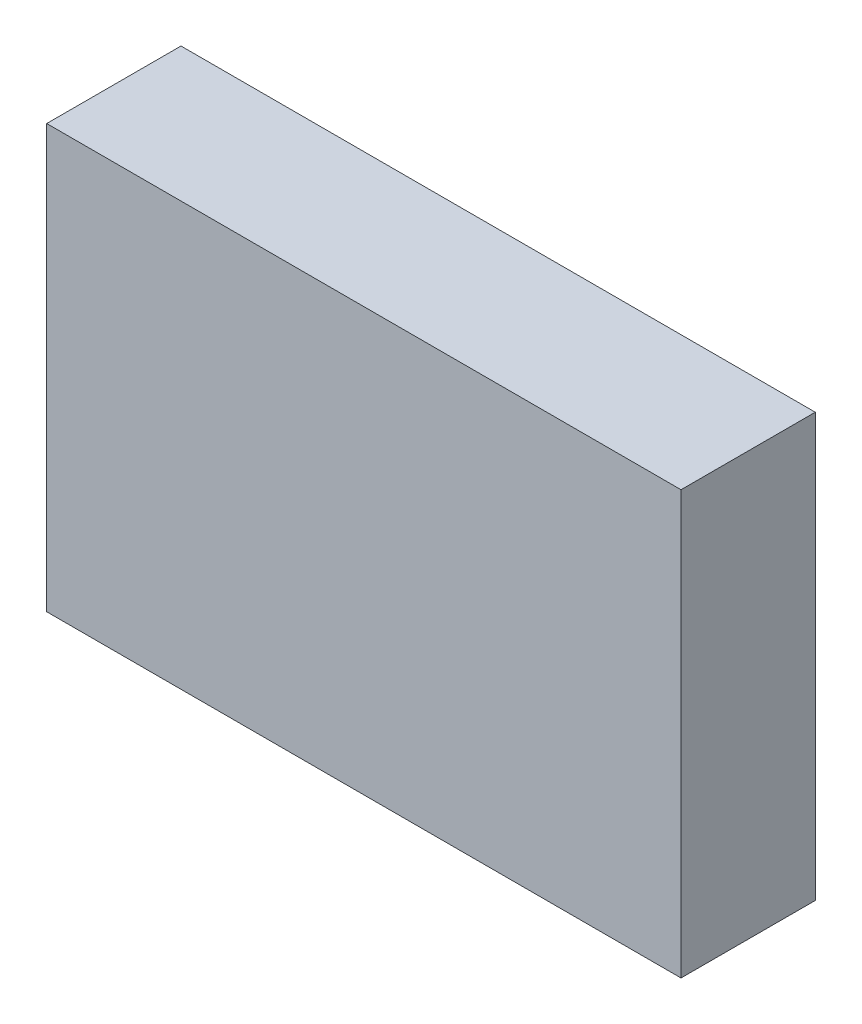
ISO-10303-21;
HEADER;
FILE_DESCRIPTION(('STEP AP214'),'2;1');
FILE_NAME('part.step','',(''),(''),'','','');
FILE_SCHEMA(('AUTOMOTIVE_DESIGN { 1 0 10303 214 1 1 1 1 }'));
ENDSEC;
DATA;
#1=APPLICATION_CONTEXT('core data for automotive mechanical design processes');
#2=APPLICATION_PROTOCOL_DEFINITION('international standard','automotive_design',2000,#1);
#3=PRODUCT_CONTEXT('',#1,'mechanical');
#4=PRODUCT('Part','Part','',(#3));
#5=PRODUCT_RELATED_PRODUCT_CATEGORY('part','',(#4));
#6=PRODUCT_DEFINITION_FORMATION('','',#4);
#7=PRODUCT_DEFINITION_CONTEXT('part definition',#1,'design');
#8=PRODUCT_DEFINITION('design','',#6,#7);
#9=PRODUCT_DEFINITION_SHAPE('','',#8);
#10=(LENGTH_UNIT() NAMED_UNIT(*) SI_UNIT(.MILLI.,.METRE.));
#11=(NAMED_UNIT(*) PLANE_ANGLE_UNIT() SI_UNIT($,.RADIAN.));
#12=(NAMED_UNIT(*) SI_UNIT($,.STERADIAN.) SOLID_ANGLE_UNIT());
#13=UNCERTAINTY_MEASURE_WITH_UNIT(LENGTH_MEASURE(1.E-05),#10,'distance_accuracy_value','');
#14=(GEOMETRIC_REPRESENTATION_CONTEXT(3) GLOBAL_UNCERTAINTY_ASSIGNED_CONTEXT((#13)) GLOBAL_UNIT_ASSIGNED_CONTEXT((#10,
#11,#12)) REPRESENTATION_CONTEXT('',''));
#15=CARTESIAN_POINT('',(0.,0.,0.));
#16=DIRECTION('',(0.,0.,1.));
#17=DIRECTION('',(1.,0.,0.));
#18=AXIS2_PLACEMENT_3D('',#15,#16,#17);
#19=CARTESIAN_POINT('',(-60.,-40.,25.4));
#20=DIRECTION('',(1.,0.,0.));
#21=DIRECTION('',(0.,0.,-1.));
#22=AXIS2_PLACEMENT_3D('',#19,#20,#21);
#23=PLANE('',#22);
#24=DIRECTION('',(0.,-1.,0.));
#25=VECTOR('',#24,1.);
#26=CARTESIAN_POINT('',(-60.,-40.,0.));
#27=LINE('',#26,#25);
#28=CARTESIAN_POINT('',(-60.,40.,0.));
#29=VERTEX_POINT('',#28);
#30=CARTESIAN_POINT('',(-60.,-40.,0.));
#31=VERTEX_POINT('',#30);
#32=EDGE_CURVE('E95',#29,#31,#27,.T.);
#33=ORIENTED_EDGE('',*,*,#32,.T.);
#34=DIRECTION('',(0.,0.,-1.));
#35=VECTOR('',#34,1.);
#36=CARTESIAN_POINT('',(-60.,-40.,25.4));
#37=LINE('',#36,#35);
#38=CARTESIAN_POINT('',(-60.,-40.,25.4));
#39=VERTEX_POINT('',#38);
#40=EDGE_CURVE('E11',#39,#31,#37,.T.);
#41=ORIENTED_EDGE('',*,*,#40,.F.);
#42=DIRECTION('',(0.,-1.,0.));
#43=VECTOR('',#42,1.);
#44=CARTESIAN_POINT('',(-60.,-40.,25.4));
#45=LINE('',#44,#43);
#46=CARTESIAN_POINT('',(-60.,40.,25.4));
#47=VERTEX_POINT('',#46);
#48=EDGE_CURVE('E83',#47,#39,#45,.T.);
#49=ORIENTED_EDGE('',*,*,#48,.F.);
#50=DIRECTION('',(0.,0.,-1.));
#51=VECTOR('',#50,1.);
#52=CARTESIAN_POINT('',(-60.,40.,25.4));
#53=LINE('',#52,#51);
#54=EDGE_CURVE('E91',#47,#29,#53,.T.);
#55=ORIENTED_EDGE('',*,*,#54,.T.);
#56=EDGE_LOOP('',(#33,#41,#49,#55));
#57=FACE_BOUND('',#56,.T.);
#58=ADVANCED_FACE('F32',(#57),#23,.F.);
#59=CARTESIAN_POINT('',(60.,-40.,25.4));
#60=DIRECTION('',(0.,1.,0.));
#61=DIRECTION('',(-1.,0.,0.));
#62=AXIS2_PLACEMENT_3D('',#59,#60,#61);
#63=PLANE('',#62);
#64=DIRECTION('',(1.,0.,0.));
#65=VECTOR('',#64,1.);
#66=CARTESIAN_POINT('',(60.,-40.,0.));
#67=LINE('',#66,#65);
#68=CARTESIAN_POINT('',(60.,-40.,0.));
#69=VERTEX_POINT('',#68);
#70=EDGE_CURVE('E87',#31,#69,#67,.T.);
#71=ORIENTED_EDGE('',*,*,#70,.T.);
#72=DIRECTION('',(0.,0.,-1.));
#73=VECTOR('',#72,1.);
#74=CARTESIAN_POINT('',(60.,-40.,25.4));
#75=LINE('',#74,#73);
#76=CARTESIAN_POINT('',(60.,-40.,25.4));
#77=VERTEX_POINT('',#76);
#78=EDGE_CURVE('E40',#77,#69,#75,.T.);
#79=ORIENTED_EDGE('',*,*,#78,.F.);
#80=DIRECTION('',(1.,0.,0.));
#81=VECTOR('',#80,1.);
#82=CARTESIAN_POINT('',(60.,-40.,25.4));
#83=LINE('',#82,#81);
#84=EDGE_CURVE('E78',#39,#77,#83,.T.);
#85=ORIENTED_EDGE('',*,*,#84,.F.);
#86=ORIENTED_EDGE('',*,*,#40,.T.);
#87=EDGE_LOOP('',(#71,#79,#85,#86));
#88=FACE_BOUND('',#87,.T.);
#89=ADVANCED_FACE('F86',(#88),#63,.F.);
#90=CARTESIAN_POINT('',(60.,-40.,25.4));
#91=DIRECTION('',(-1.,0.,0.));
#92=DIRECTION('',(0.,0.,1.));
#93=AXIS2_PLACEMENT_3D('',#90,#91,#92);
#94=PLANE('',#93);
#95=DIRECTION('',(0.,1.,0.));
#96=VECTOR('',#95,1.);
#97=CARTESIAN_POINT('',(60.,-40.,0.));
#98=LINE('',#97,#96);
#99=CARTESIAN_POINT('',(60.,40.,0.));
#100=VERTEX_POINT('',#99);
#101=EDGE_CURVE('E65',#69,#100,#98,.T.);
#102=ORIENTED_EDGE('',*,*,#101,.T.);
#103=DIRECTION('',(0.,0.,-1.));
#104=VECTOR('',#103,1.);
#105=CARTESIAN_POINT('',(60.,40.,25.4));
#106=LINE('',#105,#104);
#107=CARTESIAN_POINT('',(60.,40.,25.4));
#108=VERTEX_POINT('',#107);
#109=EDGE_CURVE('E88',#108,#100,#106,.T.);
#110=ORIENTED_EDGE('',*,*,#109,.F.);
#111=DIRECTION('',(0.,1.,0.));
#112=VECTOR('',#111,1.);
#113=CARTESIAN_POINT('',(60.,-40.,25.4));
#114=LINE('',#113,#112);
#115=EDGE_CURVE('E81',#77,#108,#114,.T.);
#116=ORIENTED_EDGE('',*,*,#115,.F.);
#117=ORIENTED_EDGE('',*,*,#78,.T.);
#118=EDGE_LOOP('',(#102,#110,#116,#117));
#119=FACE_BOUND('',#118,.T.);
#120=ADVANCED_FACE('F89',(#119),#94,.F.);
#121=CARTESIAN_POINT('',(60.,40.,25.4));
#122=DIRECTION('',(0.,-1.,0.));
#123=DIRECTION('',(1.,0.,0.));
#124=AXIS2_PLACEMENT_3D('',#121,#122,#123);
#125=PLANE('',#124);
#126=DIRECTION('',(-1.,0.,0.));
#127=VECTOR('',#126,1.);
#128=CARTESIAN_POINT('',(60.,40.,0.));
#129=LINE('',#128,#127);
#130=EDGE_CURVE('E71',#100,#29,#129,.T.);
#131=ORIENTED_EDGE('',*,*,#130,.T.);
#132=ORIENTED_EDGE('',*,*,#54,.F.);
#133=DIRECTION('',(-1.,0.,0.));
#134=VECTOR('',#133,1.);
#135=CARTESIAN_POINT('',(60.,40.,25.4));
#136=LINE('',#135,#134);
#137=EDGE_CURVE('E48',#108,#47,#136,.T.);
#138=ORIENTED_EDGE('',*,*,#137,.F.);
#139=ORIENTED_EDGE('',*,*,#109,.T.);
#140=EDGE_LOOP('',(#131,#132,#138,#139));
#141=FACE_BOUND('',#140,.T.);
#142=ADVANCED_FACE('F102',(#141),#125,.F.);
#143=CARTESIAN_POINT('',(0.,0.,25.4));
#144=DIRECTION('',(0.,0.,1.));
#145=DIRECTION('',(1.,0.,0.));
#146=AXIS2_PLACEMENT_3D('',#143,#144,#145);
#147=PLANE('',#146);
#148=ORIENTED_EDGE('',*,*,#48,.T.);
#149=ORIENTED_EDGE('',*,*,#84,.T.);
#150=ORIENTED_EDGE('',*,*,#115,.T.);
#151=ORIENTED_EDGE('',*,*,#137,.T.);
#152=EDGE_LOOP('',(#148,#149,#150,#151));
#153=FACE_BOUND('',#152,.T.);
#154=ADVANCED_FACE('F79',(#153),#147,.T.);
#155=CARTESIAN_POINT('',(0.,0.,0.));
#156=DIRECTION('',(0.,0.,1.));
#157=DIRECTION('',(1.,0.,0.));
#158=AXIS2_PLACEMENT_3D('',#155,#156,#157);
#159=PLANE('',#158);
#160=ORIENTED_EDGE('',*,*,#32,.F.);
#161=ORIENTED_EDGE('',*,*,#130,.F.);
#162=ORIENTED_EDGE('',*,*,#101,.F.);
#163=ORIENTED_EDGE('',*,*,#70,.F.);
#164=EDGE_LOOP('',(#160,#161,#162,#163));
#165=FACE_BOUND('',#164,.T.);
#166=ADVANCED_FACE('F105',(#165),#159,.F.);
#167=CLOSED_SHELL('',(#58,#89,#120,#142,#154,#166));
#168=MANIFOLD_SOLID_BREP('B2',#167);
#169=ADVANCED_BREP_SHAPE_REPRESENTATION('',(#18,#168),#14);
#170=SHAPE_DEFINITION_REPRESENTATION(#9,#169);
ENDSEC;
END-ISO-10303-21;
